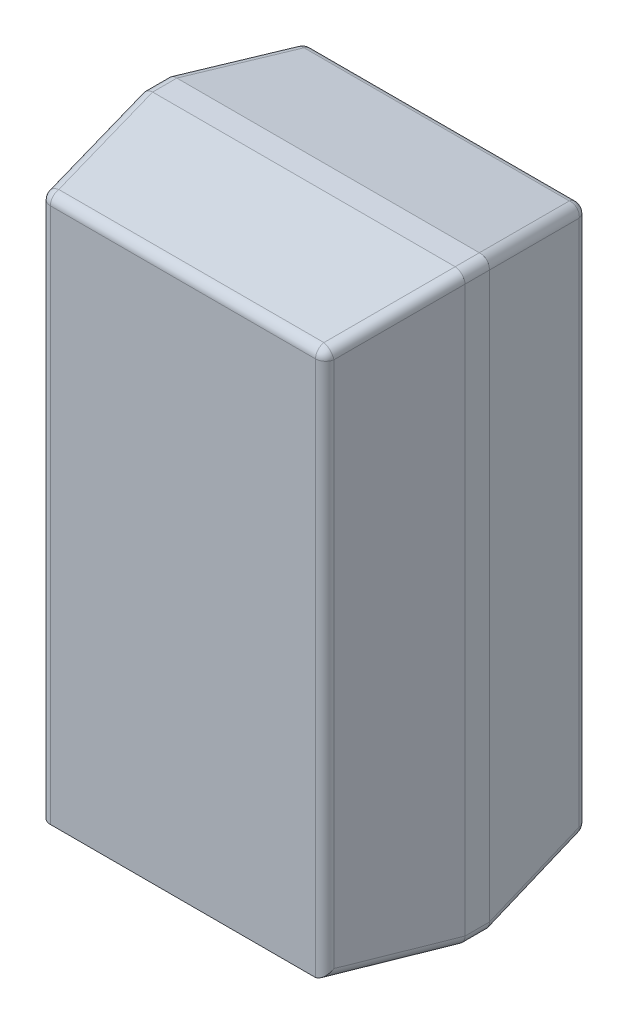
ISO-10303-21;
HEADER;
FILE_DESCRIPTION(('STEP AP214'),'2;1');
FILE_NAME('part.step','',(''),(''),'','','');
FILE_SCHEMA(('AUTOMOTIVE_DESIGN { 1 0 10303 214 1 1 1 1 }'));
ENDSEC;
DATA;
#1=APPLICATION_CONTEXT('core data for automotive mechanical design processes');
#2=APPLICATION_PROTOCOL_DEFINITION('international standard','automotive_design',2000,#1);
#3=PRODUCT_CONTEXT('',#1,'mechanical');
#4=PRODUCT('Part','Part','',(#3));
#5=PRODUCT_RELATED_PRODUCT_CATEGORY('part','',(#4));
#6=PRODUCT_DEFINITION_FORMATION('','',#4);
#7=PRODUCT_DEFINITION_CONTEXT('part definition',#1,'design');
#8=PRODUCT_DEFINITION('design','',#6,#7);
#9=PRODUCT_DEFINITION_SHAPE('','',#8);
#10=(LENGTH_UNIT() NAMED_UNIT(*) SI_UNIT(.MILLI.,.METRE.));
#11=(NAMED_UNIT(*) PLANE_ANGLE_UNIT() SI_UNIT($,.RADIAN.));
#12=(NAMED_UNIT(*) SI_UNIT($,.STERADIAN.) SOLID_ANGLE_UNIT());
#13=UNCERTAINTY_MEASURE_WITH_UNIT(LENGTH_MEASURE(1.E-05),#10,'distance_accuracy_value','');
#14=(GEOMETRIC_REPRESENTATION_CONTEXT(3) GLOBAL_UNCERTAINTY_ASSIGNED_CONTEXT((#13)) GLOBAL_UNIT_ASSIGNED_CONTEXT((#10,
#11,#12)) REPRESENTATION_CONTEXT('',''));
#15=CARTESIAN_POINT('',(0.,0.,0.));
#16=DIRECTION('',(0.,0.,1.));
#17=DIRECTION('',(1.,0.,0.));
#18=AXIS2_PLACEMENT_3D('',#15,#16,#17);
#19=CARTESIAN_POINT('',(0.,0.,0.));
#20=DIRECTION('',(0.,0.,1.));
#21=DIRECTION('',(1.,0.,0.));
#22=AXIS2_PLACEMENT_3D('',#19,#20,#21);
#23=PLANE('',#22);
#24=DIRECTION('',(0.,1.,0.));
#25=VECTOR('',#24,1.);
#26=CARTESIAN_POINT('',(0.65788296907,-0.3625,0.));
#27=LINE('',#26,#25);
#28=CARTESIAN_POINT('',(0.65788296907,-1.30788296907,0.));
#29=VERTEX_POINT('',#28);
#30=CARTESIAN_POINT('',(0.65788296907,1.30788296907,0.));
#31=VERTEX_POINT('',#30);
#32=EDGE_CURVE('E354',#29,#31,#27,.T.);
#33=ORIENTED_EDGE('',*,*,#32,.F.);
#34=DIRECTION('',(1.,0.,0.));
#35=VECTOR('',#34,1.);
#36=CARTESIAN_POINT('',(0.,-1.30788296907,0.));
#37=LINE('',#36,#35);
#38=CARTESIAN_POINT('',(-0.65788296907,-1.30788296907,0.));
#39=VERTEX_POINT('',#38);
#40=EDGE_CURVE('E489',#39,#29,#37,.T.);
#41=ORIENTED_EDGE('',*,*,#40,.F.);
#42=DIRECTION('',(0.,-1.,0.));
#43=VECTOR('',#42,1.);
#44=CARTESIAN_POINT('',(-0.65788296907,0.3625,0.));
#45=LINE('',#44,#43);
#46=CARTESIAN_POINT('',(-0.65788296907,1.30788296907,0.));
#47=VERTEX_POINT('',#46);
#48=EDGE_CURVE('E480',#47,#39,#45,.T.);
#49=ORIENTED_EDGE('',*,*,#48,.F.);
#50=DIRECTION('',(1.,0.,0.));
#51=VECTOR('',#50,1.);
#52=CARTESIAN_POINT('',(0.,1.30788296907,0.));
#53=LINE('',#52,#51);
#54=EDGE_CURVE('E487',#31,#47,#53,.F.);
#55=ORIENTED_EDGE('',*,*,#54,.F.);
#56=EDGE_LOOP('',(#33,#41,#49,#55));
#57=FACE_BOUND('',#56,.T.);
#58=ADVANCED_FACE('F17',(#57),#23,.F.);
#59=CARTESIAN_POINT('',(0.65788296907,1.30788296907,0.05));
#60=DIRECTION('',(0.509748938939204,0.509748938939257,-0.693045480831278));
#61=DIRECTION('',(0.80556409007512,6.16673379028043E-13,0.592508647009851));
#62=AXIS2_PLACEMENT_3D('',#59,#60,#61);
#63=SPHERICAL_SURFACE('',#62,0.05);
#64=CARTESIAN_POINT('',(0.68337041601696,1.33337041601696,0.0153477259584361));
#65=VERTEX_POINT('',#64);
#66=VERTEX_LOOP('',#65);
#67=FACE_BOUND('',#66,.T.);
#68=CARTESIAN_POINT('',(0.65788296907,1.30788296907,0.05));
#69=DIRECTION('',(-1.,0.,0.));
#70=DIRECTION('',(0.,0.,1.));
#71=AXIS2_PLACEMENT_3D('',#68,#69,#70);
#72=CIRCLE('',#71,0.05);
#73=CARTESIAN_POINT('',(0.65788296907,1.3571559748576,0.041504654174689));
#74=VERTEX_POINT('',#73);
#75=EDGE_CURVE('E471',#74,#31,#72,.T.);
#76=ORIENTED_EDGE('',*,*,#75,.F.);
#77=CARTESIAN_POINT('',(0.657882969070718,1.30788296907072,0.0499999999998755));
#78=DIRECTION('',(0.167506302542942,0.167506302542942,0.971536554750661));
#79=DIRECTION('',(0.985460115744395,0.,-0.169906916507374));
#80=AXIS2_PLACEMENT_3D('',#77,#78,#79);
#81=CIRCLE('',#80,0.05);
#82=CARTESIAN_POINT('',(0.707155974857589,1.30788296907036,0.0415046541746289));
#83=VERTEX_POINT('',#82);
#84=EDGE_CURVE('E357',#83,#74,#81,.T.);
#85=ORIENTED_EDGE('',*,*,#84,.F.);
#86=CARTESIAN_POINT('',(0.65788296907,1.30788296907,0.05));
#87=DIRECTION('',(0.,1.,0.));
#88=DIRECTION('',(-1.,0.,0.));
#89=AXIS2_PLACEMENT_3D('',#86,#87,#88);
#90=CIRCLE('',#89,0.05);
#91=EDGE_CURVE('E358',#31,#83,#90,.F.);
#92=ORIENTED_EDGE('',*,*,#91,.F.);
#93=EDGE_LOOP('',(#76,#85,#92));
#94=FACE_BOUND('',#93,.T.);
#95=ADVANCED_FACE('F373',(#67,#94),#63,.T.);
#96=CARTESIAN_POINT('',(-0.65788296907,1.30788296907,0.05));
#97=DIRECTION('',(-0.509748938939204,0.509748938939257,-0.693045480831278));
#98=DIRECTION('',(0.80556409007512,-6.16673379028043E-13,-0.592508647009851));
#99=AXIS2_PLACEMENT_3D('',#96,#97,#98);
#100=SPHERICAL_SURFACE('',#99,0.05);
#101=CARTESIAN_POINT('',(-0.68337041601696,1.33337041601696,0.0153477259584361));
#102=VERTEX_POINT('',#101);
#103=VERTEX_LOOP('',#102);
#104=FACE_BOUND('',#103,.T.);
#105=CARTESIAN_POINT('',(-0.657882969070342,1.30788296907034,0.0500000000000053));
#106=DIRECTION('',(0.167506302542942,-0.167506302542942,-0.971536554750661));
#107=DIRECTION('',(-0.985460115744395,0.,-0.169906916507374));
#108=AXIS2_PLACEMENT_3D('',#105,#106,#107);
#109=CIRCLE('',#108,0.05);
#110=CARTESIAN_POINT('',(-0.65788296907043,1.35715597485739,0.0415046541746505));
#111=VERTEX_POINT('',#110);
#112=CARTESIAN_POINT('',(-0.707155974857401,1.30788296907017,0.0415046541746938));
#113=VERTEX_POINT('',#112);
#114=EDGE_CURVE('E466',#111,#113,#109,.F.);
#115=ORIENTED_EDGE('',*,*,#114,.F.);
#116=CARTESIAN_POINT('',(-0.65788296907,1.30788296907,0.05));
#117=DIRECTION('',(-1.,0.,0.));
#118=DIRECTION('',(0.,0.,1.));
#119=AXIS2_PLACEMENT_3D('',#116,#117,#118);
#120=CIRCLE('',#119,0.05);
#121=EDGE_CURVE('E474',#47,#111,#120,.F.);
#122=ORIENTED_EDGE('',*,*,#121,.F.);
#123=CARTESIAN_POINT('',(-0.65788296907,1.30788296907,0.05));
#124=DIRECTION('',(0.,-1.,0.));
#125=DIRECTION('',(1.,0.,0.));
#126=AXIS2_PLACEMENT_3D('',#123,#124,#125);
#127=CIRCLE('',#126,0.05);
#128=EDGE_CURVE('E481',#113,#47,#127,.T.);
#129=ORIENTED_EDGE('',*,*,#128,.F.);
#130=EDGE_LOOP('',(#115,#122,#129));
#131=FACE_BOUND('',#130,.T.);
#132=ADVANCED_FACE('F369',(#104,#131),#100,.T.);
#133=CARTESIAN_POINT('',(-0.65788296907,0.3625,0.05));
#134=DIRECTION('',(0.,-1.,0.));
#135=DIRECTION('',(1.,0.,0.));
#136=AXIS2_PLACEMENT_3D('',#133,#134,#135);
#137=CYLINDRICAL_SURFACE('',#136,0.05);
#138=ORIENTED_EDGE('',*,*,#128,.T.);
#139=ORIENTED_EDGE('',*,*,#48,.T.);
#140=CARTESIAN_POINT('',(-0.65788296907,-1.30788296907,0.05));
#141=DIRECTION('',(0.,-1.,0.));
#142=DIRECTION('',(1.,0.,0.));
#143=AXIS2_PLACEMENT_3D('',#140,#141,#142);
#144=CIRCLE('',#143,0.05);
#145=CARTESIAN_POINT('',(-0.707155974857589,-1.30788296907036,0.0415046541746289));
#146=VERTEX_POINT('',#145);
#147=EDGE_CURVE('E20',#39,#146,#144,.F.);
#148=ORIENTED_EDGE('',*,*,#147,.T.);
#149=DIRECTION('',(0.,1.,0.));
#150=VECTOR('',#149,1.);
#151=CARTESIAN_POINT('',(-0.707155974857601,0.725,0.0415046541746889));
#152=LINE('',#151,#150);
#153=EDGE_CURVE('E359',#113,#146,#152,.F.);
#154=ORIENTED_EDGE('',*,*,#153,.F.);
#155=EDGE_LOOP('',(#138,#139,#148,#154));
#156=FACE_BOUND('',#155,.T.);
#157=ADVANCED_FACE('F372',(#156),#137,.T.);
#158=CARTESIAN_POINT('',(0.65788296907,-0.3625,0.05));
#159=DIRECTION('',(0.,1.,0.));
#160=DIRECTION('',(-1.,0.,0.));
#161=AXIS2_PLACEMENT_3D('',#158,#159,#160);
#162=CYLINDRICAL_SURFACE('',#161,0.05);
#163=CARTESIAN_POINT('',(0.65788296907,-1.30788296907,0.05));
#164=DIRECTION('',(0.,1.,0.));
#165=DIRECTION('',(-1.,0.,0.));
#166=AXIS2_PLACEMENT_3D('',#163,#164,#165);
#167=CIRCLE('',#166,0.05);
#168=CARTESIAN_POINT('',(0.707155974857421,-1.30788296907,0.0415046541747199));
#169=VERTEX_POINT('',#168);
#170=EDGE_CURVE('E455',#29,#169,#167,.F.);
#171=ORIENTED_EDGE('',*,*,#170,.F.);
#172=ORIENTED_EDGE('',*,*,#32,.T.);
#173=ORIENTED_EDGE('',*,*,#91,.T.);
#174=DIRECTION('',(0.,1.,0.));
#175=VECTOR('',#174,1.);
#176=CARTESIAN_POINT('',(0.707155974857601,-0.725,0.0415046541746889));
#177=LINE('',#176,#175);
#178=EDGE_CURVE('E320',#169,#83,#177,.T.);
#179=ORIENTED_EDGE('',*,*,#178,.F.);
#180=EDGE_LOOP('',(#171,#172,#173,#179));
#181=FACE_BOUND('',#180,.T.);
#182=ADVANCED_FACE('F597',(#181),#162,.T.);
#183=CARTESIAN_POINT('',(0.667387291794,1.317387291794,0.105125071795));
#184=DIRECTION('',(0.167506302542942,0.167506302542942,0.971536554750661));
#185=DIRECTION('',(0.985460115744395,0.,-0.169906916507374));
#186=AXIS2_PLACEMENT_3D('',#183,#184,#185);
#187=CYLINDRICAL_SURFACE('',#186,0.05);
#188=DIRECTION('',(-0.167506302544492,-0.167506302543561,-0.971536554750287));
#189=VECTOR('',#188,1.);
#190=CARTESIAN_POINT('',(0.750721784217,1.44999479000408,0.579969782022985));
#191=LINE('',#190,#189);
#192=CARTESIAN_POINT('',(0.7503608921085,1.44999739500203,0.579984891011496));
#193=VERTEX_POINT('',#192);
#194=EDGE_CURVE('E310',#193,#74,#191,.T.);
#195=ORIENTED_EDGE('',*,*,#194,.F.);
#196=CARTESIAN_POINT('',(0.75,1.4,0.584278779390589));
#197=DIRECTION('',(0.0843555647976744,0.0843555647976744,0.992858639170416));
#198=DIRECTION('',(-0.702057076517049,-0.702057076517049,0.119296783798513));
#199=AXIS2_PLACEMENT_3D('',#196,#197,#198);
#200=ELLIPSE('',#199,0.0503596363343099,0.05);
#201=CARTESIAN_POINT('',(0.79999739500203,1.40036089210847,0.579984891011501));
#202=VERTEX_POINT('',#201);
#203=EDGE_CURVE('E313',#202,#193,#200,.T.);
#204=ORIENTED_EDGE('',*,*,#203,.F.);
#205=DIRECTION('',(0.167506302543561,0.167506302544491,0.971536554750287));
#206=VECTOR('',#205,1.);
#207=CARTESIAN_POINT('',(0.707155974857601,1.30788296907,0.041504654174689));
#208=LINE('',#207,#206);
#209=EDGE_CURVE('E323',#83,#202,#208,.T.);
#210=ORIENTED_EDGE('',*,*,#209,.F.);
#211=ORIENTED_EDGE('',*,*,#84,.T.);
#212=EDGE_LOOP('',(#195,#204,#210,#211));
#213=FACE_BOUND('',#212,.T.);
#214=ADVANCED_FACE('F601',(#213),#187,.T.);
#215=CARTESIAN_POINT('',(0.2,1.30788296907,0.05));
#216=DIRECTION('',(-1.,0.,0.));
#217=DIRECTION('',(0.,0.,1.));
#218=AXIS2_PLACEMENT_3D('',#215,#216,#217);
#219=CYLINDRICAL_SURFACE('',#218,0.05);
#220=ORIENTED_EDGE('',*,*,#75,.T.);
#221=ORIENTED_EDGE('',*,*,#54,.T.);
#222=ORIENTED_EDGE('',*,*,#121,.T.);
#223=DIRECTION('',(1.,0.,0.));
#224=VECTOR('',#223,1.);
#225=CARTESIAN_POINT('',(0.4,1.3571559748576,0.0415046541746889));
#226=LINE('',#225,#224);
#227=EDGE_CURVE('E307',#74,#111,#226,.F.);
#228=ORIENTED_EDGE('',*,*,#227,.F.);
#229=EDGE_LOOP('',(#220,#221,#222,#228));
#230=FACE_BOUND('',#229,.T.);
#231=ADVANCED_FACE('F591',(#230),#219,.T.);
#232=CARTESIAN_POINT('',(-0.676506259246,1.326506259246,0.158015083019));
#233=DIRECTION('',(0.167506302542942,-0.167506302542942,-0.971536554750661));
#234=DIRECTION('',(-0.985460115744395,0.,-0.169906916507374));
#235=AXIS2_PLACEMENT_3D('',#232,#233,#234);
#236=CYLINDRICAL_SURFACE('',#235,0.05);
#237=DIRECTION('',(0.167506302543561,-0.167506302544492,-0.971536554750287));
#238=VECTOR('',#237,1.);
#239=CARTESIAN_POINT('',(-0.799994790004085,1.400721784217,0.579969782022985));
#240=LINE('',#239,#238);
#241=CARTESIAN_POINT('',(-0.799997395001936,1.40036089210837,0.579984891011533));
#242=VERTEX_POINT('',#241);
#243=EDGE_CURVE('E363',#242,#113,#240,.T.);
#244=ORIENTED_EDGE('',*,*,#243,.F.);
#245=CARTESIAN_POINT('',(-0.75,1.4,0.584278779392902));
#246=DIRECTION('',(-0.0843555647976744,0.0843555647976744,0.992858639170416));
#247=DIRECTION('',(0.702057076517049,-0.702057076517049,0.119296783798513));
#248=AXIS2_PLACEMENT_3D('',#245,#246,#247);
#249=ELLIPSE('',#248,0.0503596363343099,0.05);
#250=CARTESIAN_POINT('',(-0.7503608921085,1.44999739500196,0.579984891011507));
#251=VERTEX_POINT('',#250);
#252=EDGE_CURVE('E301',#251,#242,#249,.T.);
#253=ORIENTED_EDGE('',*,*,#252,.F.);
#254=DIRECTION('',(-0.167506302544492,0.167506302543561,0.971536554750287));
#255=VECTOR('',#254,1.);
#256=CARTESIAN_POINT('',(-0.65788296907,1.3571559748576,0.0415046541746889));
#257=LINE('',#256,#255);
#258=EDGE_CURVE('E304',#111,#251,#257,.T.);
#259=ORIENTED_EDGE('',*,*,#258,.F.);
#260=ORIENTED_EDGE('',*,*,#114,.T.);
#261=EDGE_LOOP('',(#244,#253,#259,#260));
#262=FACE_BOUND('',#261,.T.);
#263=ADVANCED_FACE('F557',(#262),#236,.T.);
#264=CARTESIAN_POINT('',(-0.75,0.725,0.29));
#265=DIRECTION('',(-0.985460115744279,0.,-0.169906916508048));
#266=DIRECTION('',(-0.169906916508048,0.,0.985460115744279));
#267=AXIS2_PLACEMENT_3D('',#264,#265,#266);
#268=PLANE('',#267);
#269=ORIENTED_EDGE('',*,*,#153,.T.);
#270=DIRECTION('',(-0.167506302543561,-0.167506302544491,0.971536554750287));
#271=VECTOR('',#270,1.);
#272=CARTESIAN_POINT('',(-0.7071559748576,-1.30788296907,0.0415046541746891));
#273=LINE('',#272,#271);
#274=CARTESIAN_POINT('',(-0.79999739500203,-1.40036089210847,0.579984891011501));
#275=VERTEX_POINT('',#274);
#276=EDGE_CURVE('E362',#146,#275,#273,.T.);
#277=ORIENTED_EDGE('',*,*,#276,.T.);
#278=DIRECTION('',(0.,-1.,0.));
#279=VECTOR('',#278,1.);
#280=CARTESIAN_POINT('',(-0.8,1.45,0.58));
#281=LINE('',#280,#279);
#282=EDGE_CURVE('E296',#242,#275,#281,.T.);
#283=ORIENTED_EDGE('',*,*,#282,.F.);
#284=ORIENTED_EDGE('',*,*,#243,.T.);
#285=EDGE_LOOP('',(#269,#277,#283,#284));
#286=FACE_BOUND('',#285,.T.);
#287=ADVANCED_FACE('F343',(#286),#268,.T.);
#288=CARTESIAN_POINT('',(-0.65788296907,-1.30788296907,0.05));
#289=DIRECTION('',(-0.509748938939204,-0.509748938939257,-0.693045480831278));
#290=DIRECTION('',(0.80556409007512,6.16673379028043E-13,-0.592508647009851));
#291=AXIS2_PLACEMENT_3D('',#288,#289,#290);
#292=SPHERICAL_SURFACE('',#291,0.05);
#293=CARTESIAN_POINT('',(-0.68337041601696,-1.33337041601696,0.0153477259584361));
#294=VERTEX_POINT('',#293);
#295=VERTEX_LOOP('',#294);
#296=FACE_BOUND('',#295,.T.);
#297=CARTESIAN_POINT('',(-0.657882969070718,-1.30788296907072,0.0499999999998755));
#298=DIRECTION('',(0.167506302542942,0.167506302542942,-0.971536554750661));
#299=DIRECTION('',(-0.985460115744395,0.,-0.169906916507374));
#300=AXIS2_PLACEMENT_3D('',#297,#298,#299);
#301=CIRCLE('',#300,0.05);
#302=CARTESIAN_POINT('',(-0.65788296907,-1.3571559748576,0.041504654174689));
#303=VERTEX_POINT('',#302);
#304=EDGE_CURVE('E290',#146,#303,#301,.F.);
#305=ORIENTED_EDGE('',*,*,#304,.F.);
#306=ORIENTED_EDGE('',*,*,#147,.F.);
#307=CARTESIAN_POINT('',(-0.65788296907,-1.30788296907,0.05));
#308=DIRECTION('',(1.,0.,0.));
#309=DIRECTION('',(0.,0.,-1.));
#310=AXIS2_PLACEMENT_3D('',#307,#308,#309);
#311=CIRCLE('',#310,0.05);
#312=EDGE_CURVE('E458',#303,#39,#311,.T.);
#313=ORIENTED_EDGE('',*,*,#312,.F.);
#314=EDGE_LOOP('',(#305,#306,#313));
#315=FACE_BOUND('',#314,.T.);
#316=ADVANCED_FACE('F339',(#296,#315),#292,.T.);
#317=CARTESIAN_POINT('',(-0.2,-1.30788296907,0.05));
#318=DIRECTION('',(1.,0.,0.));
#319=DIRECTION('',(0.,0.,-1.));
#320=AXIS2_PLACEMENT_3D('',#317,#318,#319);
#321=CYLINDRICAL_SURFACE('',#320,0.05);
#322=ORIENTED_EDGE('',*,*,#312,.T.);
#323=ORIENTED_EDGE('',*,*,#40,.T.);
#324=CARTESIAN_POINT('',(0.65788296907,-1.30788296907,0.05));
#325=DIRECTION('',(1.,0.,0.));
#326=DIRECTION('',(0.,0.,-1.));
#327=AXIS2_PLACEMENT_3D('',#324,#325,#326);
#328=CIRCLE('',#327,0.05);
#329=CARTESIAN_POINT('',(0.657882969070442,-1.35715597485741,0.0415046541747211));
#330=VERTEX_POINT('',#329);
#331=EDGE_CURVE('E324',#330,#29,#328,.T.);
#332=ORIENTED_EDGE('',*,*,#331,.F.);
#333=DIRECTION('',(1.,0.,0.));
#334=VECTOR('',#333,1.);
#335=CARTESIAN_POINT('',(-0.4,-1.3571559748576,0.0415046541746889));
#336=LINE('',#335,#334);
#337=EDGE_CURVE('E276',#303,#330,#336,.T.);
#338=ORIENTED_EDGE('',*,*,#337,.F.);
#339=EDGE_LOOP('',(#322,#323,#332,#338));
#340=FACE_BOUND('',#339,.T.);
#341=ADVANCED_FACE('F334',(#340),#321,.T.);
#342=CARTESIAN_POINT('',(0.65788296907,-1.30788296907,0.05));
#343=DIRECTION('',(0.509748938939204,-0.509748938939257,-0.693045480831278));
#344=DIRECTION('',(0.80556409007512,-6.16673379028043E-13,0.592508647009851));
#345=AXIS2_PLACEMENT_3D('',#342,#343,#344);
#346=SPHERICAL_SURFACE('',#345,0.05);
#347=CARTESIAN_POINT('',(0.68337041601696,-1.33337041601696,0.0153477259584361));
#348=VERTEX_POINT('',#347);
#349=VERTEX_LOOP('',#348);
#350=FACE_BOUND('',#349,.T.);
#351=CARTESIAN_POINT('',(0.657882969070342,-1.30788296907034,0.0500000000000053));
#352=DIRECTION('',(-0.167506302542942,0.167506302542942,-0.971536554750661));
#353=DIRECTION('',(-0.985460115744395,0.,0.169906916507374));
#354=AXIS2_PLACEMENT_3D('',#351,#352,#353);
#355=CIRCLE('',#354,0.05);
#356=EDGE_CURVE('E270',#330,#169,#355,.F.);
#357=ORIENTED_EDGE('',*,*,#356,.F.);
#358=ORIENTED_EDGE('',*,*,#331,.T.);
#359=ORIENTED_EDGE('',*,*,#170,.T.);
#360=EDGE_LOOP('',(#357,#358,#359));
#361=FACE_BOUND('',#360,.T.);
#362=ADVANCED_FACE('F329',(#350,#361),#346,.T.);
#363=CARTESIAN_POINT('',(0.75,-0.725,0.29));
#364=DIRECTION('',(0.985460115744279,0.,-0.169906916508048));
#365=DIRECTION('',(-0.169906916508048,0.,-0.985460115744279));
#366=AXIS2_PLACEMENT_3D('',#363,#364,#365);
#367=PLANE('',#366);
#368=ORIENTED_EDGE('',*,*,#209,.T.);
#369=DIRECTION('',(0.,1.,0.));
#370=VECTOR('',#369,1.);
#371=CARTESIAN_POINT('',(0.8,-1.45,0.58));
#372=LINE('',#371,#370);
#373=CARTESIAN_POINT('',(0.799997395001896,-1.4003608921085,0.579984891011518));
#374=VERTEX_POINT('',#373);
#375=EDGE_CURVE('E264',#374,#202,#372,.T.);
#376=ORIENTED_EDGE('',*,*,#375,.F.);
#377=DIRECTION('',(-0.167506302542942,0.167506302542942,-0.971536554750661));
#378=VECTOR('',#377,1.);
#379=CARTESIAN_POINT('',(0.72577926503323,-1.32650625924566,0.149519737193688));
#380=LINE('',#379,#378);
#381=EDGE_CURVE('E267',#169,#374,#380,.F.);
#382=ORIENTED_EDGE('',*,*,#381,.F.);
#383=ORIENTED_EDGE('',*,*,#178,.T.);
#384=EDGE_LOOP('',(#368,#376,#382,#383));
#385=FACE_BOUND('',#384,.T.);
#386=ADVANCED_FACE('F333',(#385),#367,.T.);
#387=CARTESIAN_POINT('',(0.75,1.4,0.));
#388=DIRECTION('',(0.,0.,1.));
#389=DIRECTION('',(1.,0.,0.));
#390=AXIS2_PLACEMENT_3D('',#387,#388,#389);
#391=CYLINDRICAL_SURFACE('',#390,0.05);
#392=DIRECTION('',(0.,0.,1.));
#393=VECTOR('',#392,1.);
#394=CARTESIAN_POINT('',(0.8,1.4,0.));
#395=LINE('',#394,#393);
#396=CARTESIAN_POINT('',(0.799997716790704,1.40033786869504,0.700013699256034));
#397=VERTEX_POINT('',#396);
#398=EDGE_CURVE('E261',#202,#397,#395,.T.);
#399=ORIENTED_EDGE('',*,*,#398,.F.);
#400=ORIENTED_EDGE('',*,*,#203,.T.);
#401=DIRECTION('',(0.,0.,1.));
#402=VECTOR('',#401,1.);
#403=CARTESIAN_POINT('',(0.75,1.45,0.));
#404=LINE('',#403,#402);
#405=CARTESIAN_POINT('',(0.750337868695001,1.4499977167907,0.700013699256027));
#406=VERTEX_POINT('',#405);
#407=EDGE_CURVE('E249',#406,#193,#404,.F.);
#408=ORIENTED_EDGE('',*,*,#407,.F.);
#409=CARTESIAN_POINT('',(0.75,1.4,0.695861873488498));
#410=DIRECTION('',(-0.0816570162562247,-0.0816570162562247,0.993309751986892));
#411=DIRECTION('',(-0.702376061448659,-0.702376061448659,-0.115480459852473));
#412=AXIS2_PLACEMENT_3D('',#409,#410,#411);
#413=ELLIPSE('',#412,0.0503367654450047,0.05);
#414=EDGE_CURVE('E258',#397,#406,#413,.T.);
#415=ORIENTED_EDGE('',*,*,#414,.F.);
#416=EDGE_LOOP('',(#399,#400,#408,#415));
#417=FACE_BOUND('',#416,.T.);
#418=ADVANCED_FACE('F637',(#417),#391,.T.);
#419=CARTESIAN_POINT('',(0.4,1.4,0.29));
#420=DIRECTION('',(0.,0.985460115744279,-0.169906916508048));
#421=DIRECTION('',(0.,0.169906916508048,0.985460115744279));
#422=AXIS2_PLACEMENT_3D('',#419,#420,#421);
#423=PLANE('',#422);
#424=ORIENTED_EDGE('',*,*,#227,.T.);
#425=ORIENTED_EDGE('',*,*,#258,.T.);
#426=DIRECTION('',(1.,0.,0.));
#427=VECTOR('',#426,1.);
#428=CARTESIAN_POINT('',(0.8,1.45,0.58));
#429=LINE('',#428,#427);
#430=EDGE_CURVE('E252',#193,#251,#429,.F.);
#431=ORIENTED_EDGE('',*,*,#430,.F.);
#432=ORIENTED_EDGE('',*,*,#194,.T.);
#433=EDGE_LOOP('',(#424,#425,#431,#432));
#434=FACE_BOUND('',#433,.T.);
#435=ADVANCED_FACE('F589',(#434),#423,.T.);
#436=CARTESIAN_POINT('',(-0.75,1.4,0.));
#437=DIRECTION('',(0.,0.,1.));
#438=DIRECTION('',(1.,0.,0.));
#439=AXIS2_PLACEMENT_3D('',#436,#437,#438);
#440=CYLINDRICAL_SURFACE('',#439,0.05);
#441=DIRECTION('',(0.,0.,1.));
#442=VECTOR('',#441,1.);
#443=CARTESIAN_POINT('',(-0.75,1.45,0.));
#444=LINE('',#443,#442);
#445=CARTESIAN_POINT('',(-0.750337868695001,1.4499977167907,0.700013699256026));
#446=VERTEX_POINT('',#445);
#447=EDGE_CURVE('E253',#251,#446,#444,.T.);
#448=ORIENTED_EDGE('',*,*,#447,.F.);
#449=ORIENTED_EDGE('',*,*,#252,.T.);
#450=DIRECTION('',(0.,0.,1.));
#451=VECTOR('',#450,1.);
#452=CARTESIAN_POINT('',(-0.8,1.4,0.));
#453=LINE('',#452,#451);
#454=CARTESIAN_POINT('',(-0.799997716790704,1.400337868695,0.700013699256026));
#455=VERTEX_POINT('',#454);
#456=EDGE_CURVE('E293',#455,#242,#453,.F.);
#457=ORIENTED_EDGE('',*,*,#456,.F.);
#458=CARTESIAN_POINT('',(-0.75,1.4,0.695861873488446));
#459=DIRECTION('',(0.0816570162562247,-0.0816570162562247,0.993309751986892));
#460=DIRECTION('',(0.702376061448659,-0.702376061448659,-0.115480459852473));
#461=AXIS2_PLACEMENT_3D('',#458,#459,#460);
#462=ELLIPSE('',#461,0.0503367654450047,0.05);
#463=EDGE_CURVE('E248',#446,#455,#462,.T.);
#464=ORIENTED_EDGE('',*,*,#463,.F.);
#465=EDGE_LOOP('',(#448,#449,#457,#464));
#466=FACE_BOUND('',#465,.T.);
#467=ADVANCED_FACE('F563',(#466),#440,.T.);
#468=CARTESIAN_POINT('',(-0.8,1.45,0.));
#469=DIRECTION('',(-1.,0.,0.));
#470=DIRECTION('',(0.,-1.,0.));
#471=AXIS2_PLACEMENT_3D('',#468,#469,#470);
#472=PLANE('',#471);
#473=ORIENTED_EDGE('',*,*,#456,.T.);
#474=ORIENTED_EDGE('',*,*,#282,.T.);
#475=DIRECTION('',(0.,0.,1.));
#476=VECTOR('',#475,1.);
#477=CARTESIAN_POINT('',(-0.799999999999999,-1.4,0.));
#478=LINE('',#477,#476);
#479=CARTESIAN_POINT('',(-0.799999999999975,-1.4,0.699999999999686));
#480=VERTEX_POINT('',#479);
#481=EDGE_CURVE('E297',#275,#480,#478,.T.);
#482=ORIENTED_EDGE('',*,*,#481,.T.);
#483=DIRECTION('',(0.,1.,0.));
#484=VECTOR('',#483,1.);
#485=CARTESIAN_POINT('',(-0.799999999999901,0.725,0.699999999999984));
#486=LINE('',#485,#484);
#487=EDGE_CURVE('E235',#455,#480,#486,.F.);
#488=ORIENTED_EDGE('',*,*,#487,.F.);
#489=EDGE_LOOP('',(#473,#474,#482,#488));
#490=FACE_BOUND('',#489,.T.);
#491=ADVANCED_FACE('F566',(#490),#472,.T.);
#492=CARTESIAN_POINT('',(-0.667387291794,-1.317387291794,0.105125071795));
#493=DIRECTION('',(0.167506302542942,0.167506302542942,-0.971536554750661));
#494=DIRECTION('',(-0.985460115744395,0.,-0.169906916507374));
#495=AXIS2_PLACEMENT_3D('',#492,#493,#494);
#496=CYLINDRICAL_SURFACE('',#495,0.05);
#497=DIRECTION('',(0.167506302544492,0.167506302543561,-0.971536554750287));
#498=VECTOR('',#497,1.);
#499=CARTESIAN_POINT('',(-0.750721784217,-1.44999479000408,0.579969782022985));
#500=LINE('',#499,#498);
#501=CARTESIAN_POINT('',(-0.7503608921085,-1.44999739500203,0.579984891011496));
#502=VERTEX_POINT('',#501);
#503=EDGE_CURVE('E287',#502,#303,#500,.T.);
#504=ORIENTED_EDGE('',*,*,#503,.F.);
#505=CARTESIAN_POINT('',(-0.75,-1.4,0.584278779390589));
#506=DIRECTION('',(-0.0843555647976744,-0.0843555647976744,0.992858639170416));
#507=DIRECTION('',(0.702057076517049,0.702057076517049,0.119296783798513));
#508=AXIS2_PLACEMENT_3D('',#505,#506,#507);
#509=ELLIPSE('',#508,0.0503596363343099,0.05);
#510=EDGE_CURVE('E232',#275,#502,#509,.T.);
#511=ORIENTED_EDGE('',*,*,#510,.F.);
#512=ORIENTED_EDGE('',*,*,#276,.F.);
#513=ORIENTED_EDGE('',*,*,#304,.T.);
#514=EDGE_LOOP('',(#504,#511,#512,#513));
#515=FACE_BOUND('',#514,.T.);
#516=ADVANCED_FACE('F662',(#515),#496,.T.);
#517=CARTESIAN_POINT('',(-0.4,-1.4,0.29));
#518=DIRECTION('',(0.,-0.985460115744279,-0.169906916508048));
#519=DIRECTION('',(0.,0.169906916508048,-0.985460115744279));
#520=AXIS2_PLACEMENT_3D('',#517,#518,#519);
#521=PLANE('',#520);
#522=DIRECTION('',(-0.167506302542942,0.167506302542942,-0.971536554750661));
#523=VECTOR('',#522,1.);
#524=CARTESIAN_POINT('',(0.676506259246517,-1.3757792650332,0.149519737193545));
#525=LINE('',#524,#523);
#526=CARTESIAN_POINT('',(0.7503608921085,-1.4499973950019,0.579984891011518));
#527=VERTEX_POINT('',#526);
#528=EDGE_CURVE('E273',#527,#330,#525,.T.);
#529=ORIENTED_EDGE('',*,*,#528,.F.);
#530=DIRECTION('',(1.,0.,0.));
#531=VECTOR('',#530,1.);
#532=CARTESIAN_POINT('',(-0.8,-1.45,0.58));
#533=LINE('',#532,#531);
#534=EDGE_CURVE('E226',#502,#527,#533,.T.);
#535=ORIENTED_EDGE('',*,*,#534,.F.);
#536=ORIENTED_EDGE('',*,*,#503,.T.);
#537=ORIENTED_EDGE('',*,*,#337,.T.);
#538=EDGE_LOOP('',(#529,#535,#536,#537));
#539=FACE_BOUND('',#538,.T.);
#540=ADVANCED_FACE('F669',(#539),#521,.T.);
#541=CARTESIAN_POINT('',(0.676506259246,-1.326506259246,0.158015083019));
#542=DIRECTION('',(-0.167506302542942,0.167506302542942,-0.971536554750661));
#543=DIRECTION('',(-0.985460115744395,0.,0.169906916507374));
#544=AXIS2_PLACEMENT_3D('',#541,#542,#543);
#545=CYLINDRICAL_SURFACE('',#544,0.05);
#546=ORIENTED_EDGE('',*,*,#381,.T.);
#547=CARTESIAN_POINT('',(0.75,-1.4,0.584278779392902));
#548=DIRECTION('',(0.0843555647976744,-0.0843555647976744,0.992858639170416));
#549=DIRECTION('',(-0.702057076517049,0.702057076517049,0.119296783798513));
#550=AXIS2_PLACEMENT_3D('',#547,#548,#549);
#551=ELLIPSE('',#550,0.0503596363343099,0.05);
#552=EDGE_CURVE('E215',#527,#374,#551,.T.);
#553=ORIENTED_EDGE('',*,*,#552,.F.);
#554=ORIENTED_EDGE('',*,*,#528,.T.);
#555=ORIENTED_EDGE('',*,*,#356,.T.);
#556=EDGE_LOOP('',(#546,#553,#554,#555));
#557=FACE_BOUND('',#556,.T.);
#558=ADVANCED_FACE('F677',(#557),#545,.T.);
#559=CARTESIAN_POINT('',(0.8,-1.45,0.));
#560=DIRECTION('',(1.,0.,0.));
#561=DIRECTION('',(0.,1.,0.));
#562=AXIS2_PLACEMENT_3D('',#559,#560,#561);
#563=PLANE('',#562);
#564=ORIENTED_EDGE('',*,*,#398,.T.);
#565=DIRECTION('',(0.,1.,0.));
#566=VECTOR('',#565,1.);
#567=CARTESIAN_POINT('',(0.799999999999901,-0.725,0.699999999999984));
#568=LINE('',#567,#566);
#569=CARTESIAN_POINT('',(0.799997716790811,-1.400337868695,0.700013699256044));
#570=VERTEX_POINT('',#569);
#571=EDGE_CURVE('E210',#570,#397,#568,.T.);
#572=ORIENTED_EDGE('',*,*,#571,.F.);
#573=DIRECTION('',(0.,0.,1.));
#574=VECTOR('',#573,1.);
#575=CARTESIAN_POINT('',(0.8,-1.4,0.));
#576=LINE('',#575,#574);
#577=EDGE_CURVE('E221',#374,#570,#576,.T.);
#578=ORIENTED_EDGE('',*,*,#577,.F.);
#579=ORIENTED_EDGE('',*,*,#375,.T.);
#580=EDGE_LOOP('',(#564,#572,#578,#579));
#581=FACE_BOUND('',#580,.T.);
#582=ADVANCED_FACE('F685',(#581),#563,.T.);
#583=CARTESIAN_POINT('',(0.669412401077,1.319412401077,1.179387467026));
#584=DIRECTION('',(-0.16222142113092,-0.16222142113092,0.973328526784523));
#585=DIRECTION('',(0.986393923832116,0.,0.164398987305522));
#586=AXIS2_PLACEMENT_3D('',#583,#584,#585);
#587=CYLINDRICAL_SURFACE('',#586,0.05);
#588=DIRECTION('',(-0.162221421130435,-0.162221421131038,0.973328526784584));
#589=VECTOR('',#588,1.);
#590=CARTESIAN_POINT('',(0.799995433581226,1.40067573739,0.700027398512038));
#591=LINE('',#590,#589);
#592=CARTESIAN_POINT('',(0.706963341772755,1.30764364558117,1.25821994936515));
#593=VERTEX_POINT('',#592);
#594=EDGE_CURVE('E206',#397,#593,#591,.T.);
#595=ORIENTED_EDGE('',*,*,#594,.F.);
#596=ORIENTED_EDGE('',*,*,#414,.T.);
#597=DIRECTION('',(0.162221421131038,0.162221421130435,-0.973328526784584));
#598=VECTOR('',#597,1.);
#599=CARTESIAN_POINT('',(0.657643645581,1.35696334177257,1.2582199493651));
#600=LINE('',#599,#598);
#601=CARTESIAN_POINT('',(0.657643645581034,1.35696334177276,1.25821994936513));
#602=VERTEX_POINT('',#601);
#603=EDGE_CURVE('E578',#602,#406,#600,.T.);
#604=ORIENTED_EDGE('',*,*,#603,.F.);
#605=CARTESIAN_POINT('',(0.657643645581332,1.30764364558133,1.24999999999994));
#606=DIRECTION('',(-0.16222142113092,-0.16222142113092,0.973328526784523));
#607=DIRECTION('',(0.986393923832116,0.,0.164398987305522));
#608=AXIS2_PLACEMENT_3D('',#605,#606,#607);
#609=CIRCLE('',#608,0.05);
#610=EDGE_CURVE('E209',#593,#602,#609,.T.);
#611=ORIENTED_EDGE('',*,*,#610,.F.);
#612=EDGE_LOOP('',(#595,#596,#604,#611));
#613=FACE_BOUND('',#612,.T.);
#614=ADVANCED_FACE('F693',(#613),#587,.T.);
#615=CARTESIAN_POINT('',(0.8,1.45,0.));
#616=DIRECTION('',(0.,1.,0.));
#617=DIRECTION('',(0.,0.,1.));
#618=AXIS2_PLACEMENT_3D('',#615,#616,#617);
#619=PLANE('',#618);
#620=ORIENTED_EDGE('',*,*,#407,.T.);
#621=ORIENTED_EDGE('',*,*,#430,.T.);
#622=ORIENTED_EDGE('',*,*,#447,.T.);
#623=DIRECTION('',(1.,0.,0.));
#624=VECTOR('',#623,1.);
#625=CARTESIAN_POINT('',(0.4,1.4499999999999,0.699999999999984));
#626=LINE('',#625,#624);
#627=EDGE_CURVE('E412',#406,#446,#626,.F.);
#628=ORIENTED_EDGE('',*,*,#627,.F.);
#629=EDGE_LOOP('',(#620,#621,#622,#628));
#630=FACE_BOUND('',#629,.T.);
#631=ADVANCED_FACE('F586',(#630),#619,.T.);
#632=CARTESIAN_POINT('',(-0.677965032656,1.327965032656,1.128071677552));
#633=DIRECTION('',(0.16222142113092,-0.16222142113092,0.973328526784523));
#634=DIRECTION('',(0.986393923832116,0.,-0.164398987305522));
#635=AXIS2_PLACEMENT_3D('',#632,#633,#634);
#636=CYLINDRICAL_SURFACE('',#635,0.05);
#637=DIRECTION('',(0.162221421131038,-0.162221421130435,0.973328526784584));
#638=VECTOR('',#637,1.);
#639=CARTESIAN_POINT('',(-0.75067573739,1.44999543358123,0.700027398512038));
#640=LINE('',#639,#638);
#641=CARTESIAN_POINT('',(-0.657643645581,1.35696334177275,1.25821994936513));
#642=VERTEX_POINT('',#641);
#643=EDGE_CURVE('E418',#446,#642,#640,.T.);
#644=ORIENTED_EDGE('',*,*,#643,.F.);
#645=ORIENTED_EDGE('',*,*,#463,.T.);
#646=DIRECTION('',(-0.162221421130435,0.162221421131038,-0.973328526784584));
#647=VECTOR('',#646,1.);
#648=CARTESIAN_POINT('',(-0.706963341772571,1.307643645581,1.2582199493651));
#649=LINE('',#648,#647);
#650=CARTESIAN_POINT('',(-0.706963341772754,1.30764364558103,1.25821994936513));
#651=VERTEX_POINT('',#650);
#652=EDGE_CURVE('E239',#651,#455,#649,.T.);
#653=ORIENTED_EDGE('',*,*,#652,.F.);
#654=CARTESIAN_POINT('',(-0.657643645581324,1.30764364558132,1.24999999999993));
#655=DIRECTION('',(0.16222142113092,-0.16222142113092,0.973328526784523));
#656=DIRECTION('',(0.986393923832116,0.,-0.164398987305522));
#657=AXIS2_PLACEMENT_3D('',#654,#655,#656);
#658=CIRCLE('',#657,0.05);
#659=EDGE_CURVE('E410',#642,#651,#658,.T.);
#660=ORIENTED_EDGE('',*,*,#659,.F.);
#661=EDGE_LOOP('',(#644,#645,#653,#660));
#662=FACE_BOUND('',#661,.T.);
#663=ADVANCED_FACE('F572',(#662),#636,.T.);
#664=CARTESIAN_POINT('',(-0.75,0.725,1.));
#665=DIRECTION('',(-0.986393923832198,0.,0.164398987305033));
#666=DIRECTION('',(0.164398987305033,0.,0.986393923832198));
#667=AXIS2_PLACEMENT_3D('',#664,#665,#666);
#668=PLANE('',#667);
#669=ORIENTED_EDGE('',*,*,#652,.T.);
#670=ORIENTED_EDGE('',*,*,#487,.T.);
#671=CARTESIAN_POINT('',(-0.75,-1.4,0.999999999999998));
#672=DIRECTION('',(-0.986393923832198,0.,0.164398987305033));
#673=DIRECTION('',(0.164398987305033,0.,0.986393923832198));
#674=AXIS2_PLACEMENT_3D('',#671,#672,#673);
#675=ELLIPSE('',#674,0.304138126515511,0.05);
#676=CARTESIAN_POINT('',(-0.785355339059391,-1.43535533905926,0.787867965643222));
#677=VERTEX_POINT('',#676);
#678=EDGE_CURVE('E238',#677,#480,#675,.F.);
#679=ORIENTED_EDGE('',*,*,#678,.F.);
#680=DIRECTION('',(0.162221421130434,0.162221421131089,0.973328526784576));
#681=VECTOR('',#680,1.);
#682=CARTESIAN_POINT('',(-0.785355339059254,-1.435355339059,0.787867965644042));
#683=LINE('',#682,#681);
#684=CARTESIAN_POINT('',(-0.706963341772618,-1.35696334177228,1.2582199493651));
#685=VERTEX_POINT('',#684);
#686=EDGE_CURVE('E244',#677,#685,#683,.T.);
#687=ORIENTED_EDGE('',*,*,#686,.T.);
#688=DIRECTION('',(0.,1.,0.));
#689=VECTOR('',#688,1.);
#690=CARTESIAN_POINT('',(-0.706963341772634,0.3625,1.25821994936511));
#691=LINE('',#690,#689);
#692=EDGE_CURVE('E174',#651,#685,#691,.F.);
#693=ORIENTED_EDGE('',*,*,#692,.F.);
#694=EDGE_LOOP('',(#669,#670,#679,#687,#693));
#695=FACE_BOUND('',#694,.T.);
#696=ADVANCED_FACE('F569',(#695),#668,.T.);
#697=CARTESIAN_POINT('',(-0.75,-1.4,0.));
#698=DIRECTION('',(0.,0.,1.));
#699=DIRECTION('',(1.,0.,0.));
#700=AXIS2_PLACEMENT_3D('',#697,#698,#699);
#701=CYLINDRICAL_SURFACE('',#700,0.05);
#702=DIRECTION('',(0.,0.,-1.));
#703=VECTOR('',#702,1.);
#704=CARTESIAN_POINT('',(-0.75,-1.45,0.));
#705=LINE('',#704,#703);
#706=CARTESIAN_POINT('',(-0.75,-1.44999999999998,0.699999999999688));
#707=VERTEX_POINT('',#706);
#708=EDGE_CURVE('E229',#707,#502,#705,.T.);
#709=ORIENTED_EDGE('',*,*,#708,.F.);
#710=CARTESIAN_POINT('',(-0.75,-1.4,1.));
#711=DIRECTION('',(0.,-0.986393923832198,0.164398987305033));
#712=DIRECTION('',(0.,0.164398987305033,0.986393923832198));
#713=AXIS2_PLACEMENT_3D('',#710,#711,#712);
#714=ELLIPSE('',#713,0.304138126515511,0.05);
#715=EDGE_CURVE('E171',#677,#707,#714,.T.);
#716=ORIENTED_EDGE('',*,*,#715,.F.);
#717=ORIENTED_EDGE('',*,*,#678,.T.);
#718=ORIENTED_EDGE('',*,*,#481,.F.);
#719=ORIENTED_EDGE('',*,*,#510,.T.);
#720=EDGE_LOOP('',(#709,#716,#717,#718,#719));
#721=FACE_BOUND('',#720,.T.);
#722=ADVANCED_FACE('F720',(#721),#701,.T.);
#723=CARTESIAN_POINT('',(-0.8,-1.45,0.));
#724=DIRECTION('',(0.,-1.,0.));
#725=DIRECTION('',(0.,0.,-1.));
#726=AXIS2_PLACEMENT_3D('',#723,#724,#725);
#727=PLANE('',#726);
#728=DIRECTION('',(0.,0.,1.));
#729=VECTOR('',#728,1.);
#730=CARTESIAN_POINT('',(0.75,-1.45,0.));
#731=LINE('',#730,#729);
#732=CARTESIAN_POINT('',(0.750337868695001,-1.44999771679081,0.700013699256044));
#733=VERTEX_POINT('',#732);
#734=EDGE_CURVE('E218',#733,#527,#731,.F.);
#735=ORIENTED_EDGE('',*,*,#734,.F.);
#736=DIRECTION('',(1.,0.,0.));
#737=VECTOR('',#736,1.);
#738=CARTESIAN_POINT('',(-0.4,-1.4499999999999,0.699999999999984));
#739=LINE('',#738,#737);
#740=EDGE_CURVE('E142',#707,#733,#739,.T.);
#741=ORIENTED_EDGE('',*,*,#740,.F.);
#742=ORIENTED_EDGE('',*,*,#708,.T.);
#743=ORIENTED_EDGE('',*,*,#534,.T.);
#744=EDGE_LOOP('',(#735,#741,#742,#743));
#745=FACE_BOUND('',#744,.T.);
#746=ADVANCED_FACE('F727',(#745),#727,.T.);
#747=CARTESIAN_POINT('',(0.75,-1.4,0.));
#748=DIRECTION('',(0.,0.,1.));
#749=DIRECTION('',(1.,0.,0.));
#750=AXIS2_PLACEMENT_3D('',#747,#748,#749);
#751=CYLINDRICAL_SURFACE('',#750,0.05);
#752=ORIENTED_EDGE('',*,*,#734,.T.);
#753=ORIENTED_EDGE('',*,*,#552,.T.);
#754=ORIENTED_EDGE('',*,*,#577,.T.);
#755=CARTESIAN_POINT('',(0.75,-1.4,0.695861873488446));
#756=DIRECTION('',(0.0816570162562247,-0.0816570162562247,-0.993309751986892));
#757=DIRECTION('',(0.702376061448659,-0.702376061448659,0.115480459852473));
#758=AXIS2_PLACEMENT_3D('',#755,#756,#757);
#759=ELLIPSE('',#758,0.0503367654450047,0.05);
#760=EDGE_CURVE('E146',#733,#570,#759,.F.);
#761=ORIENTED_EDGE('',*,*,#760,.F.);
#762=EDGE_LOOP('',(#752,#753,#754,#761));
#763=FACE_BOUND('',#762,.T.);
#764=ADVANCED_FACE('F734',(#763),#751,.T.);
#765=CARTESIAN_POINT('',(0.75,-0.725,1.));
#766=DIRECTION('',(0.986393923832198,0.,0.164398987305033));
#767=DIRECTION('',(0.164398987305033,0.,-0.986393923832198));
#768=AXIS2_PLACEMENT_3D('',#765,#766,#767);
#769=PLANE('',#768);
#770=DIRECTION('',(0.,-1.,0.));
#771=VECTOR('',#770,1.);
#772=CARTESIAN_POINT('',(0.706963341772634,-0.3625,1.25821994936511));
#773=LINE('',#772,#771);
#774=CARTESIAN_POINT('',(0.706963341772793,-1.30764364558112,1.25821994936509));
#775=VERTEX_POINT('',#774);
#776=EDGE_CURVE('E500',#775,#593,#773,.F.);
#777=ORIENTED_EDGE('',*,*,#776,.F.);
#778=DIRECTION('',(0.16222142113092,-0.16222142113092,-0.973328526784523));
#779=VECTOR('',#778,1.);
#780=CARTESIAN_POINT('',(0.727284728847613,-1.32796503265574,1.13629162691723));
#781=LINE('',#780,#779);
#782=EDGE_CURVE('E147',#570,#775,#781,.F.);
#783=ORIENTED_EDGE('',*,*,#782,.F.);
#784=ORIENTED_EDGE('',*,*,#571,.T.);
#785=ORIENTED_EDGE('',*,*,#594,.T.);
#786=EDGE_LOOP('',(#777,#783,#784,#785));
#787=FACE_BOUND('',#786,.T.);
#788=ADVANCED_FACE('F198',(#787),#769,.T.);
#789=CARTESIAN_POINT('',(0.657643645581,1.307643645581,1.25));
#790=DIRECTION('',(0.511996367662042,0.511996367662072,0.689724176031056));
#791=DIRECTION('',(-0.802950083904556,0.,0.596046275684755));
#792=AXIS2_PLACEMENT_3D('',#789,#790,#791);
#793=SPHERICAL_SURFACE('',#792,0.05);
#794=CARTESIAN_POINT('',(0.683243463964102,1.3332434639641,1.28448620880155));
#795=VERTEX_POINT('',#794);
#796=VERTEX_LOOP('',#795);
#797=FACE_BOUND('',#796,.T.);
#798=ORIENTED_EDGE('',*,*,#610,.T.);
#799=CARTESIAN_POINT('',(0.657643645581,1.307643645581,1.25));
#800=DIRECTION('',(1.,0.,0.));
#801=DIRECTION('',(0.,0.,-1.));
#802=AXIS2_PLACEMENT_3D('',#799,#800,#801);
#803=CIRCLE('',#802,0.05);
#804=CARTESIAN_POINT('',(0.657643645581,1.307643645581,1.3));
#805=VERTEX_POINT('',#804);
#806=EDGE_CURVE('E35',#805,#602,#803,.F.);
#807=ORIENTED_EDGE('',*,*,#806,.F.);
#808=CARTESIAN_POINT('',(0.657643645581,1.307643645581,1.25));
#809=DIRECTION('',(0.,-1.,0.));
#810=DIRECTION('',(1.,0.,0.));
#811=AXIS2_PLACEMENT_3D('',#808,#809,#810);
#812=CIRCLE('',#811,0.05);
#813=EDGE_CURVE('E498',#593,#805,#812,.T.);
#814=ORIENTED_EDGE('',*,*,#813,.F.);
#815=EDGE_LOOP('',(#798,#807,#814));
#816=FACE_BOUND('',#815,.T.);
#817=ADVANCED_FACE('F193',(#797,#816),#793,.T.);
#818=CARTESIAN_POINT('',(0.4,1.4,1.));
#819=DIRECTION('',(0.,0.986393923832198,0.164398987305033));
#820=DIRECTION('',(0.,-0.164398987305033,0.986393923832198));
#821=AXIS2_PLACEMENT_3D('',#818,#819,#820);
#822=PLANE('',#821);
#823=ORIENTED_EDGE('',*,*,#603,.T.);
#824=ORIENTED_EDGE('',*,*,#627,.T.);
#825=ORIENTED_EDGE('',*,*,#643,.T.);
#826=DIRECTION('',(1.,0.,0.));
#827=VECTOR('',#826,1.);
#828=CARTESIAN_POINT('',(0.2,1.35696334177263,1.25821994936511));
#829=LINE('',#828,#827);
#830=EDGE_CURVE('E180',#602,#642,#829,.F.);
#831=ORIENTED_EDGE('',*,*,#830,.F.);
#832=EDGE_LOOP('',(#823,#824,#825,#831));
#833=FACE_BOUND('',#832,.T.);
#834=ADVANCED_FACE('F188',(#833),#822,.T.);
#835=CARTESIAN_POINT('',(-0.657643645581,1.307643645581,1.25));
#836=DIRECTION('',(-0.511996367662042,0.511996367662072,0.689724176031056));
#837=DIRECTION('',(-0.802950083904556,0.,-0.596046275684755));
#838=AXIS2_PLACEMENT_3D('',#835,#836,#837);
#839=SPHERICAL_SURFACE('',#838,0.05);
#840=CARTESIAN_POINT('',(-0.683243463964102,1.3332434639641,1.28448620880155));
#841=VERTEX_POINT('',#840);
#842=VERTEX_LOOP('',#841);
#843=FACE_BOUND('',#842,.T.);
#844=ORIENTED_EDGE('',*,*,#659,.T.);
#845=CARTESIAN_POINT('',(-0.657643645581,1.307643645581,1.25));
#846=DIRECTION('',(0.,1.,0.));
#847=DIRECTION('',(-1.,0.,0.));
#848=AXIS2_PLACEMENT_3D('',#845,#846,#847);
#849=CIRCLE('',#848,0.05);
#850=CARTESIAN_POINT('',(-0.657643645581,1.307643645581,1.3));
#851=VERTEX_POINT('',#850);
#852=EDGE_CURVE('E177',#851,#651,#849,.F.);
#853=ORIENTED_EDGE('',*,*,#852,.F.);
#854=CARTESIAN_POINT('',(-0.657643645581,1.307643645581,1.25));
#855=DIRECTION('',(1.,0.,0.));
#856=DIRECTION('',(0.,0.,-1.));
#857=AXIS2_PLACEMENT_3D('',#854,#855,#856);
#858=CIRCLE('',#857,0.05);
#859=EDGE_CURVE('E163',#642,#851,#858,.T.);
#860=ORIENTED_EDGE('',*,*,#859,.F.);
#861=EDGE_LOOP('',(#844,#853,#860));
#862=FACE_BOUND('',#861,.T.);
#863=ADVANCED_FACE('F183',(#843,#862),#839,.T.);
#864=CARTESIAN_POINT('',(-0.657643645581,0.3625,1.25));
#865=DIRECTION('',(0.,1.,0.));
#866=DIRECTION('',(-1.,0.,0.));
#867=AXIS2_PLACEMENT_3D('',#864,#865,#866);
#868=CYLINDRICAL_SURFACE('',#867,0.05);
#869=ORIENTED_EDGE('',*,*,#852,.T.);
#870=ORIENTED_EDGE('',*,*,#692,.T.);
#871=CARTESIAN_POINT('',(-0.657643645581,-1.35833333333342,1.25));
#872=DIRECTION('',(0.,-0.986393923832198,0.164398987305033));
#873=DIRECTION('',(0.,0.164398987305033,0.986393923832198));
#874=AXIS2_PLACEMENT_3D('',#871,#872,#873);
#875=ELLIPSE('',#874,0.0506896877524824,0.05);
#876=CARTESIAN_POINT('',(-0.657643645581,-1.35000000000005,1.3));
#877=VERTEX_POINT('',#876);
#878=EDGE_CURVE('E170',#877,#685,#875,.T.);
#879=ORIENTED_EDGE('',*,*,#878,.F.);
#880=DIRECTION('',(0.,1.,0.));
#881=VECTOR('',#880,1.);
#882=CARTESIAN_POINT('',(-0.657643645581,0.,1.3));
#883=LINE('',#882,#881);
#884=EDGE_CURVE('E161',#851,#877,#883,.F.);
#885=ORIENTED_EDGE('',*,*,#884,.F.);
#886=EDGE_LOOP('',(#869,#870,#879,#885));
#887=FACE_BOUND('',#886,.T.);
#888=ADVANCED_FACE('F187',(#887),#868,.T.);
#889=CARTESIAN_POINT('',(-0.4,-1.4,1.));
#890=DIRECTION('',(0.,-0.986393923832198,0.164398987305033));
#891=DIRECTION('',(0.,-0.164398987305033,-0.986393923832198));
#892=AXIS2_PLACEMENT_3D('',#889,#890,#891);
#893=PLANE('',#892);
#894=ORIENTED_EDGE('',*,*,#878,.T.);
#895=ORIENTED_EDGE('',*,*,#686,.F.);
#896=ORIENTED_EDGE('',*,*,#715,.T.);
#897=ORIENTED_EDGE('',*,*,#740,.T.);
#898=DIRECTION('',(0.16222142113092,-0.16222142113092,-0.973328526784523));
#899=VECTOR('',#898,1.);
#900=CARTESIAN_POINT('',(0.677965032655183,-1.37728472884763,1.13629162691714));
#901=LINE('',#900,#899);
#902=CARTESIAN_POINT('',(0.650680303808426,-1.35000000000034,1.30000000000002));
#903=VERTEX_POINT('',#902);
#904=EDGE_CURVE('E132',#903,#733,#901,.T.);
#905=ORIENTED_EDGE('',*,*,#904,.F.);
#906=DIRECTION('',(1.,0.,0.));
#907=VECTOR('',#906,1.);
#908=CARTESIAN_POINT('',(0.,-1.35,1.3));
#909=LINE('',#908,#907);
#910=EDGE_CURVE('E137',#877,#903,#909,.T.);
#911=ORIENTED_EDGE('',*,*,#910,.F.);
#912=EDGE_LOOP('',(#894,#895,#896,#897,#905,#911));
#913=FACE_BOUND('',#912,.T.);
#914=ADVANCED_FACE('F135',(#913),#893,.T.);
#915=CARTESIAN_POINT('',(0.677965032656,-1.327965032656,1.128071677552));
#916=DIRECTION('',(0.16222142113092,-0.16222142113092,-0.973328526784523));
#917=DIRECTION('',(-0.986393923832116,0.,-0.164398987305522));
#918=AXIS2_PLACEMENT_3D('',#915,#916,#917);
#919=CYLINDRICAL_SURFACE('',#918,0.05);
#920=ORIENTED_EDGE('',*,*,#904,.T.);
#921=ORIENTED_EDGE('',*,*,#760,.T.);
#922=ORIENTED_EDGE('',*,*,#782,.T.);
#923=CARTESIAN_POINT('',(0.657643645581152,-1.3076436455813,1.25000000000003));
#924=DIRECTION('',(0.106401748796258,-0.762306179015663,-0.638410492776895));
#925=DIRECTION('',(-0.125322363846917,-0.647216570735438,0.751934183080728));
#926=AXIS2_PLACEMENT_3D('',#923,#924,#925);
#927=ELLIPSE('',#926,0.0655904430219405,0.05);
#928=CARTESIAN_POINT('',(0.657643645581116,-1.34951727263242,1.30000000000001));
#929=VERTEX_POINT('',#928);
#930=EDGE_CURVE('E154',#929,#775,#927,.F.);
#931=ORIENTED_EDGE('',*,*,#930,.F.);
#932=CARTESIAN_POINT('',(0.649310312247971,-1.29931031224797,1.3));
#933=DIRECTION('',(0.,0.,1.));
#934=DIRECTION('',(0.707106781186548,-0.707106781186548,0.));
#935=AXIS2_PLACEMENT_3D('',#932,#933,#934);
#936=ELLIPSE('',#935,0.0513701166914109,0.05);
#937=EDGE_CURVE('E150',#903,#929,#936,.T.);
#938=ORIENTED_EDGE('',*,*,#937,.F.);
#939=EDGE_LOOP('',(#920,#921,#922,#931,#938));
#940=FACE_BOUND('',#939,.T.);
#941=ADVANCED_FACE('F151',(#940),#919,.T.);
#942=CARTESIAN_POINT('',(0.657643645581,-0.3625,1.25));
#943=DIRECTION('',(0.,-1.,0.));
#944=DIRECTION('',(1.,0.,0.));
#945=AXIS2_PLACEMENT_3D('',#942,#943,#944);
#946=CYLINDRICAL_SURFACE('',#945,0.05);
#947=DIRECTION('',(0.,1.,0.));
#948=VECTOR('',#947,1.);
#949=CARTESIAN_POINT('',(0.657643645581,0.,1.3));
#950=LINE('',#949,#948);
#951=EDGE_CURVE('E26',#929,#805,#950,.T.);
#952=ORIENTED_EDGE('',*,*,#951,.F.);
#953=ORIENTED_EDGE('',*,*,#930,.T.);
#954=ORIENTED_EDGE('',*,*,#776,.T.);
#955=ORIENTED_EDGE('',*,*,#813,.T.);
#956=EDGE_LOOP('',(#952,#953,#954,#955));
#957=FACE_BOUND('',#956,.T.);
#958=ADVANCED_FACE('F389',(#957),#946,.T.);
#959=CARTESIAN_POINT('',(0.2,1.307643645581,1.25));
#960=DIRECTION('',(1.,0.,0.));
#961=DIRECTION('',(0.,0.,-1.));
#962=AXIS2_PLACEMENT_3D('',#959,#960,#961);
#963=CYLINDRICAL_SURFACE('',#962,0.05);
#964=ORIENTED_EDGE('',*,*,#859,.T.);
#965=DIRECTION('',(1.,0.,0.));
#966=VECTOR('',#965,1.);
#967=CARTESIAN_POINT('',(0.,1.307643645581,1.3));
#968=LINE('',#967,#966);
#969=EDGE_CURVE('E11',#805,#851,#968,.F.);
#970=ORIENTED_EDGE('',*,*,#969,.F.);
#971=ORIENTED_EDGE('',*,*,#806,.T.);
#972=ORIENTED_EDGE('',*,*,#830,.T.);
#973=EDGE_LOOP('',(#964,#970,#971,#972));
#974=FACE_BOUND('',#973,.T.);
#975=ADVANCED_FACE('F384',(#974),#963,.T.);
#976=CARTESIAN_POINT('',(0.,0.,1.3));
#977=DIRECTION('',(0.,0.,1.));
#978=DIRECTION('',(1.,0.,0.));
#979=AXIS2_PLACEMENT_3D('',#976,#977,#978);
#980=PLANE('',#979);
#981=ORIENTED_EDGE('',*,*,#951,.T.);
#982=ORIENTED_EDGE('',*,*,#969,.T.);
#983=ORIENTED_EDGE('',*,*,#884,.T.);
#984=ORIENTED_EDGE('',*,*,#910,.T.);
#985=ORIENTED_EDGE('',*,*,#937,.T.);
#986=EDGE_LOOP('',(#981,#982,#983,#984,#985));
#987=FACE_BOUND('',#986,.T.);
#988=ADVANCED_FACE('F159',(#987),#980,.T.);
#989=CLOSED_SHELL('',(#58,#95,#132,#157,#182,#214,#231,#263,#287,#316,#341,#362,#386,#418,#435,
#467,#491,#516,#540,#558,#582,#614,#631,#663,#696,#722,#746,#764,#788,#817,#834,#863,#888,#914,
#941,#958,#975,#988));
#990=MANIFOLD_SOLID_BREP('B1',#989);
#991=ADVANCED_BREP_SHAPE_REPRESENTATION('',(#18,#990),#14);
#992=SHAPE_DEFINITION_REPRESENTATION(#9,#991);
ENDSEC;
END-ISO-10303-21;
